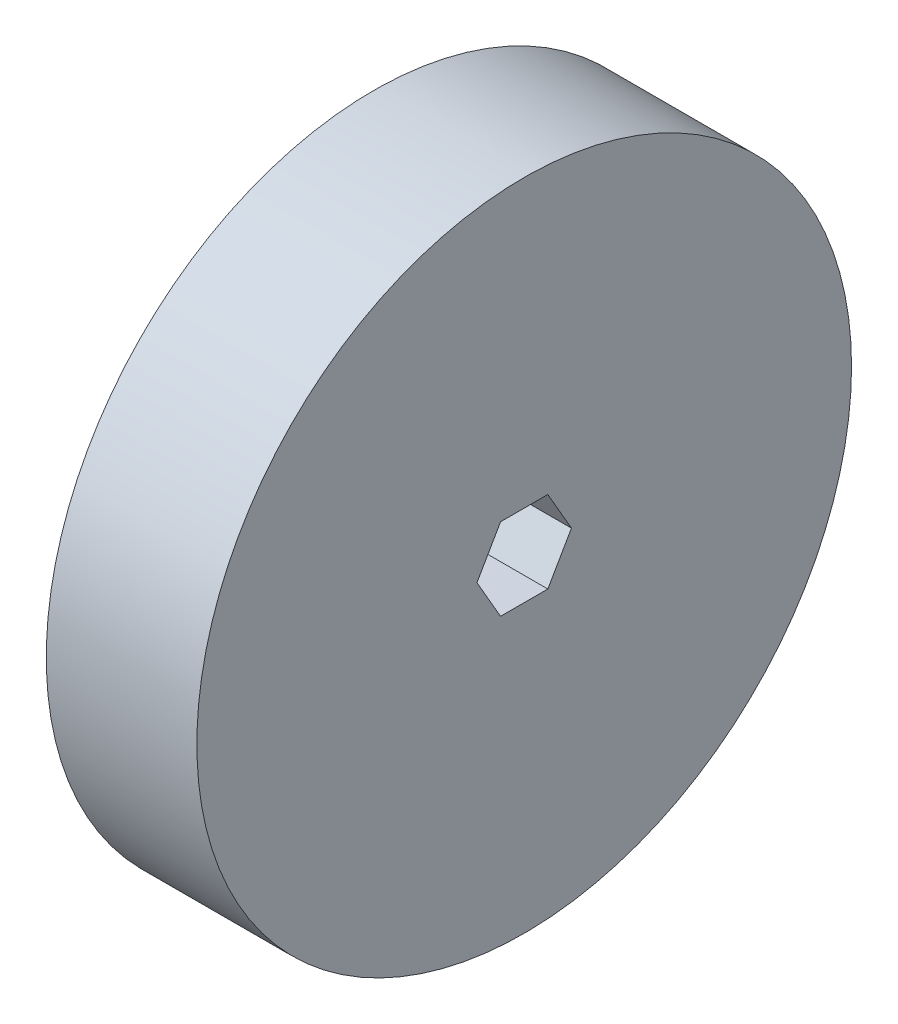
ISO-10303-21;
HEADER;
FILE_DESCRIPTION(('STEP AP214'),'2;1');
FILE_NAME('part.step','',(''),(''),'','','');
FILE_SCHEMA(('AUTOMOTIVE_DESIGN { 1 0 10303 214 1 1 1 1 }'));
ENDSEC;
DATA;
#1=APPLICATION_CONTEXT('core data for automotive mechanical design processes');
#2=APPLICATION_PROTOCOL_DEFINITION('international standard','automotive_design',2000,#1);
#3=PRODUCT_CONTEXT('',#1,'mechanical');
#4=PRODUCT('Part','Part','',(#3));
#5=PRODUCT_RELATED_PRODUCT_CATEGORY('part','',(#4));
#6=PRODUCT_DEFINITION_FORMATION('','',#4);
#7=PRODUCT_DEFINITION_CONTEXT('part definition',#1,'design');
#8=PRODUCT_DEFINITION('design','',#6,#7);
#9=PRODUCT_DEFINITION_SHAPE('','',#8);
#10=(LENGTH_UNIT() NAMED_UNIT(*) SI_UNIT(.MILLI.,.METRE.));
#11=(NAMED_UNIT(*) PLANE_ANGLE_UNIT() SI_UNIT($,.RADIAN.));
#12=(NAMED_UNIT(*) SI_UNIT($,.STERADIAN.) SOLID_ANGLE_UNIT());
#13=UNCERTAINTY_MEASURE_WITH_UNIT(LENGTH_MEASURE(1.E-05),#10,'distance_accuracy_value','');
#14=(GEOMETRIC_REPRESENTATION_CONTEXT(3) GLOBAL_UNCERTAINTY_ASSIGNED_CONTEXT((#13)) GLOBAL_UNIT_ASSIGNED_CONTEXT((#10,
#11,#12)) REPRESENTATION_CONTEXT('',''));
#15=CARTESIAN_POINT('',(0.,0.,0.));
#16=DIRECTION('',(0.,0.,1.));
#17=DIRECTION('',(1.,0.,0.));
#18=AXIS2_PLACEMENT_3D('',#15,#16,#17);
#19=CARTESIAN_POINT('',(23.368,0.,0.));
#20=DIRECTION('',(1.,0.,0.));
#21=DIRECTION('',(0.,0.,-1.));
#22=AXIS2_PLACEMENT_3D('',#19,#20,#21);
#23=PLANE('',#22);
#24=CARTESIAN_POINT('',(23.368,0.,0.));
#25=DIRECTION('',(1.,0.,0.));
#26=DIRECTION('',(0.,0.,-1.));
#27=AXIS2_PLACEMENT_3D('',#24,#25,#26);
#28=CIRCLE('',#27,50.8);
#29=CARTESIAN_POINT('',(23.368,0.,-50.8));
#30=VERTEX_POINT('',#29);
#31=EDGE_CURVE('E11',#30,#30,#28,.T.);
#32=ORIENTED_EDGE('',*,*,#31,.T.);
#33=EDGE_LOOP('',(#32));
#34=FACE_BOUND('',#33,.T.);
#35=DIRECTION('',(0.,0.,1.));
#36=VECTOR('',#35,1.);
#37=CARTESIAN_POINT('',(23.368,6.35,-3.66617420935412));
#38=LINE('',#37,#36);
#39=CARTESIAN_POINT('',(23.368,6.35,-3.66617420935412));
#40=VERTEX_POINT('',#39);
#41=CARTESIAN_POINT('',(23.368,6.35,3.66617420935412));
#42=VERTEX_POINT('',#41);
#43=EDGE_CURVE('E94',#40,#42,#38,.T.);
#44=ORIENTED_EDGE('',*,*,#43,.F.);
#45=DIRECTION('',(0.,0.866025403784439,0.5));
#46=VECTOR('',#45,1.);
#47=CARTESIAN_POINT('',(23.368,0.,-7.33234841870825));
#48=LINE('',#47,#46);
#49=CARTESIAN_POINT('',(23.368,0.,-7.33234841870825));
#50=VERTEX_POINT('',#49);
#51=EDGE_CURVE('E86',#50,#40,#48,.T.);
#52=ORIENTED_EDGE('',*,*,#51,.F.);
#53=DIRECTION('',(0.,0.866025403784439,-0.5));
#54=VECTOR('',#53,1.);
#55=CARTESIAN_POINT('',(23.368,-6.35,-3.66617420935412));
#56=LINE('',#55,#54);
#57=CARTESIAN_POINT('',(23.368,-6.35,-3.66617420935412));
#58=VERTEX_POINT('',#57);
#59=EDGE_CURVE('E114',#58,#50,#56,.T.);
#60=ORIENTED_EDGE('',*,*,#59,.F.);
#61=DIRECTION('',(0.,0.,-1.));
#62=VECTOR('',#61,1.);
#63=CARTESIAN_POINT('',(23.368,-6.35,3.66617420935412));
#64=LINE('',#63,#62);
#65=CARTESIAN_POINT('',(23.368,-6.35,3.66617420935412));
#66=VERTEX_POINT('',#65);
#67=EDGE_CURVE('E112',#66,#58,#64,.T.);
#68=ORIENTED_EDGE('',*,*,#67,.F.);
#69=DIRECTION('',(0.,-0.866025403784439,-0.5));
#70=VECTOR('',#69,1.);
#71=CARTESIAN_POINT('',(23.368,0.,7.33234841870825));
#72=LINE('',#71,#70);
#73=CARTESIAN_POINT('',(23.368,0.,7.33234841870825));
#74=VERTEX_POINT('',#73);
#75=EDGE_CURVE('E108',#74,#66,#72,.T.);
#76=ORIENTED_EDGE('',*,*,#75,.F.);
#77=DIRECTION('',(0.,-0.866025403784439,0.5));
#78=VECTOR('',#77,1.);
#79=CARTESIAN_POINT('',(23.368,6.35,3.66617420935412));
#80=LINE('',#79,#78);
#81=EDGE_CURVE('E106',#42,#74,#80,.T.);
#82=ORIENTED_EDGE('',*,*,#81,.F.);
#83=EDGE_LOOP('',(#44,#52,#60,#68,#76,#82));
#84=FACE_BOUND('',#83,.T.);
#85=ADVANCED_FACE('F33',(#34,#84),#23,.T.);
#86=CARTESIAN_POINT('',(0.,0.,0.));
#87=DIRECTION('',(1.,0.,0.));
#88=DIRECTION('',(0.,0.,-1.));
#89=AXIS2_PLACEMENT_3D('',#86,#87,#88);
#90=PLANE('',#89);
#91=CARTESIAN_POINT('',(0.,0.,0.));
#92=DIRECTION('',(1.,0.,0.));
#93=DIRECTION('',(0.,0.,-1.));
#94=AXIS2_PLACEMENT_3D('',#91,#92,#93);
#95=CIRCLE('',#94,50.8);
#96=CARTESIAN_POINT('',(0.,0.,-50.8));
#97=VERTEX_POINT('',#96);
#98=EDGE_CURVE('E37',#97,#97,#95,.T.);
#99=ORIENTED_EDGE('',*,*,#98,.F.);
#100=EDGE_LOOP('',(#99));
#101=FACE_BOUND('',#100,.T.);
#102=DIRECTION('',(0.,0.866025403784439,0.5));
#103=VECTOR('',#102,1.);
#104=CARTESIAN_POINT('',(0.,0.,-7.33234841870825));
#105=LINE('',#104,#103);
#106=CARTESIAN_POINT('',(0.,0.,-7.33234841870825));
#107=VERTEX_POINT('',#106);
#108=CARTESIAN_POINT('',(0.,6.35,-3.66617420935412));
#109=VERTEX_POINT('',#108);
#110=EDGE_CURVE('E56',#107,#109,#105,.T.);
#111=ORIENTED_EDGE('',*,*,#110,.T.);
#112=DIRECTION('',(0.,0.,1.));
#113=VECTOR('',#112,1.);
#114=CARTESIAN_POINT('',(0.,6.35,-3.66617420935412));
#115=LINE('',#114,#113);
#116=CARTESIAN_POINT('',(0.,6.35,3.66617420935412));
#117=VERTEX_POINT('',#116);
#118=EDGE_CURVE('E101',#109,#117,#115,.T.);
#119=ORIENTED_EDGE('',*,*,#118,.T.);
#120=DIRECTION('',(0.,-0.866025403784439,0.5));
#121=VECTOR('',#120,1.);
#122=CARTESIAN_POINT('',(0.,6.35,3.66617420935412));
#123=LINE('',#122,#121);
#124=CARTESIAN_POINT('',(0.,0.,7.33234841870825));
#125=VERTEX_POINT('',#124);
#126=EDGE_CURVE('E118',#117,#125,#123,.T.);
#127=ORIENTED_EDGE('',*,*,#126,.T.);
#128=DIRECTION('',(0.,-0.866025403784439,-0.5));
#129=VECTOR('',#128,1.);
#130=CARTESIAN_POINT('',(0.,0.,7.33234841870825));
#131=LINE('',#130,#129);
#132=CARTESIAN_POINT('',(0.,-6.35,3.66617420935412));
#133=VERTEX_POINT('',#132);
#134=EDGE_CURVE('E121',#125,#133,#131,.T.);
#135=ORIENTED_EDGE('',*,*,#134,.T.);
#136=DIRECTION('',(0.,0.,-1.));
#137=VECTOR('',#136,1.);
#138=CARTESIAN_POINT('',(0.,-6.35,3.66617420935412));
#139=LINE('',#138,#137);
#140=CARTESIAN_POINT('',(0.,-6.35,-3.66617420935412));
#141=VERTEX_POINT('',#140);
#142=EDGE_CURVE('E124',#133,#141,#139,.T.);
#143=ORIENTED_EDGE('',*,*,#142,.T.);
#144=DIRECTION('',(0.,0.866025403784439,-0.5));
#145=VECTOR('',#144,1.);
#146=CARTESIAN_POINT('',(0.,-6.35,-3.66617420935412));
#147=LINE('',#146,#145);
#148=EDGE_CURVE('E95',#141,#107,#147,.T.);
#149=ORIENTED_EDGE('',*,*,#148,.T.);
#150=EDGE_LOOP('',(#111,#119,#127,#135,#143,#149));
#151=FACE_BOUND('',#150,.T.);
#152=ADVANCED_FACE('F141',(#101,#151),#90,.F.);
#153=CARTESIAN_POINT('',(23.368,0.,0.));
#154=DIRECTION('',(-1.,0.,0.));
#155=DIRECTION('',(0.,0.,1.));
#156=AXIS2_PLACEMENT_3D('',#153,#154,#155);
#157=CYLINDRICAL_SURFACE('',#156,50.8);
#158=ORIENTED_EDGE('',*,*,#31,.F.);
#159=EDGE_LOOP('',(#158));
#160=FACE_BOUND('',#159,.T.);
#161=ORIENTED_EDGE('',*,*,#98,.T.);
#162=EDGE_LOOP('',(#161));
#163=FACE_BOUND('',#162,.T.);
#164=ADVANCED_FACE('F35',(#160,#163),#157,.T.);
#165=CARTESIAN_POINT('',(23.368,0.,-7.33234841870825));
#166=DIRECTION('',(0.,-0.5,0.866025403784439));
#167=DIRECTION('',(0.,-0.866025403784439,-0.5));
#168=AXIS2_PLACEMENT_3D('',#165,#166,#167);
#169=PLANE('',#168);
#170=ORIENTED_EDGE('',*,*,#110,.F.);
#171=DIRECTION('',(-1.,0.,0.));
#172=VECTOR('',#171,1.);
#173=CARTESIAN_POINT('',(23.368,0.,-7.33234841870825));
#174=LINE('',#173,#172);
#175=EDGE_CURVE('E90',#50,#107,#174,.T.);
#176=ORIENTED_EDGE('',*,*,#175,.F.);
#177=ORIENTED_EDGE('',*,*,#51,.T.);
#178=DIRECTION('',(-1.,0.,0.));
#179=VECTOR('',#178,1.);
#180=CARTESIAN_POINT('',(23.368,6.35,-3.66617420935412));
#181=LINE('',#180,#179);
#182=EDGE_CURVE('E89',#40,#109,#181,.T.);
#183=ORIENTED_EDGE('',*,*,#182,.T.);
#184=EDGE_LOOP('',(#170,#176,#177,#183));
#185=FACE_BOUND('',#184,.T.);
#186=ADVANCED_FACE('F88',(#185),#169,.T.);
#187=CARTESIAN_POINT('',(23.368,6.35,-3.66617420935412));
#188=DIRECTION('',(0.,-1.,0.));
#189=DIRECTION('',(0.,0.,-1.));
#190=AXIS2_PLACEMENT_3D('',#187,#188,#189);
#191=PLANE('',#190);
#192=ORIENTED_EDGE('',*,*,#118,.F.);
#193=ORIENTED_EDGE('',*,*,#182,.F.);
#194=ORIENTED_EDGE('',*,*,#43,.T.);
#195=DIRECTION('',(-1.,0.,0.));
#196=VECTOR('',#195,1.);
#197=CARTESIAN_POINT('',(23.368,6.35,3.66617420935412));
#198=LINE('',#197,#196);
#199=EDGE_CURVE('E102',#42,#117,#198,.T.);
#200=ORIENTED_EDGE('',*,*,#199,.T.);
#201=EDGE_LOOP('',(#192,#193,#194,#200));
#202=FACE_BOUND('',#201,.T.);
#203=ADVANCED_FACE('F98',(#202),#191,.T.);
#204=CARTESIAN_POINT('',(23.368,6.35,3.66617420935412));
#205=DIRECTION('',(0.,-0.5,-0.866025403784439));
#206=DIRECTION('',(0.,0.866025403784439,-0.5));
#207=AXIS2_PLACEMENT_3D('',#204,#205,#206);
#208=PLANE('',#207);
#209=ORIENTED_EDGE('',*,*,#126,.F.);
#210=ORIENTED_EDGE('',*,*,#199,.F.);
#211=ORIENTED_EDGE('',*,*,#81,.T.);
#212=DIRECTION('',(-1.,0.,0.));
#213=VECTOR('',#212,1.);
#214=CARTESIAN_POINT('',(23.368,0.,7.33234841870825));
#215=LINE('',#214,#213);
#216=EDGE_CURVE('E133',#74,#125,#215,.T.);
#217=ORIENTED_EDGE('',*,*,#216,.T.);
#218=EDGE_LOOP('',(#209,#210,#211,#217));
#219=FACE_BOUND('',#218,.T.);
#220=ADVANCED_FACE('F137',(#219),#208,.T.);
#221=CARTESIAN_POINT('',(23.368,0.,7.33234841870825));
#222=DIRECTION('',(0.,0.5,-0.866025403784439));
#223=DIRECTION('',(0.,0.866025403784439,0.5));
#224=AXIS2_PLACEMENT_3D('',#221,#222,#223);
#225=PLANE('',#224);
#226=ORIENTED_EDGE('',*,*,#134,.F.);
#227=ORIENTED_EDGE('',*,*,#216,.F.);
#228=ORIENTED_EDGE('',*,*,#75,.T.);
#229=DIRECTION('',(-1.,0.,0.));
#230=VECTOR('',#229,1.);
#231=CARTESIAN_POINT('',(23.368,-6.35,3.66617420935412));
#232=LINE('',#231,#230);
#233=EDGE_CURVE('E131',#66,#133,#232,.T.);
#234=ORIENTED_EDGE('',*,*,#233,.T.);
#235=EDGE_LOOP('',(#226,#227,#228,#234));
#236=FACE_BOUND('',#235,.T.);
#237=ADVANCED_FACE('F149',(#236),#225,.T.);
#238=CARTESIAN_POINT('',(23.368,-6.35,3.66617420935412));
#239=DIRECTION('',(0.,1.,0.));
#240=DIRECTION('',(0.,0.,1.));
#241=AXIS2_PLACEMENT_3D('',#238,#239,#240);
#242=PLANE('',#241);
#243=ORIENTED_EDGE('',*,*,#142,.F.);
#244=ORIENTED_EDGE('',*,*,#233,.F.);
#245=ORIENTED_EDGE('',*,*,#67,.T.);
#246=DIRECTION('',(-1.,0.,0.));
#247=VECTOR('',#246,1.);
#248=CARTESIAN_POINT('',(23.368,-6.35,-3.66617420935412));
#249=LINE('',#248,#247);
#250=EDGE_CURVE('E48',#58,#141,#249,.T.);
#251=ORIENTED_EDGE('',*,*,#250,.T.);
#252=EDGE_LOOP('',(#243,#244,#245,#251));
#253=FACE_BOUND('',#252,.T.);
#254=ADVANCED_FACE('F147',(#253),#242,.T.);
#255=CARTESIAN_POINT('',(23.368,-6.35,-3.66617420935412));
#256=DIRECTION('',(0.,0.5,0.866025403784439));
#257=DIRECTION('',(0.,-0.866025403784438,0.5));
#258=AXIS2_PLACEMENT_3D('',#255,#256,#257);
#259=PLANE('',#258);
#260=ORIENTED_EDGE('',*,*,#148,.F.);
#261=ORIENTED_EDGE('',*,*,#250,.F.);
#262=ORIENTED_EDGE('',*,*,#59,.T.);
#263=ORIENTED_EDGE('',*,*,#175,.T.);
#264=EDGE_LOOP('',(#260,#261,#262,#263));
#265=FACE_BOUND('',#264,.T.);
#266=ADVANCED_FACE('F143',(#265),#259,.T.);
#267=CLOSED_SHELL('',(#85,#152,#164,#186,#203,#220,#237,#254,#266));
#268=MANIFOLD_SOLID_BREP('B2',#267);
#269=ADVANCED_BREP_SHAPE_REPRESENTATION('',(#18,#268),#14);
#270=SHAPE_DEFINITION_REPRESENTATION(#9,#269);
ENDSEC;
END-ISO-10303-21;
